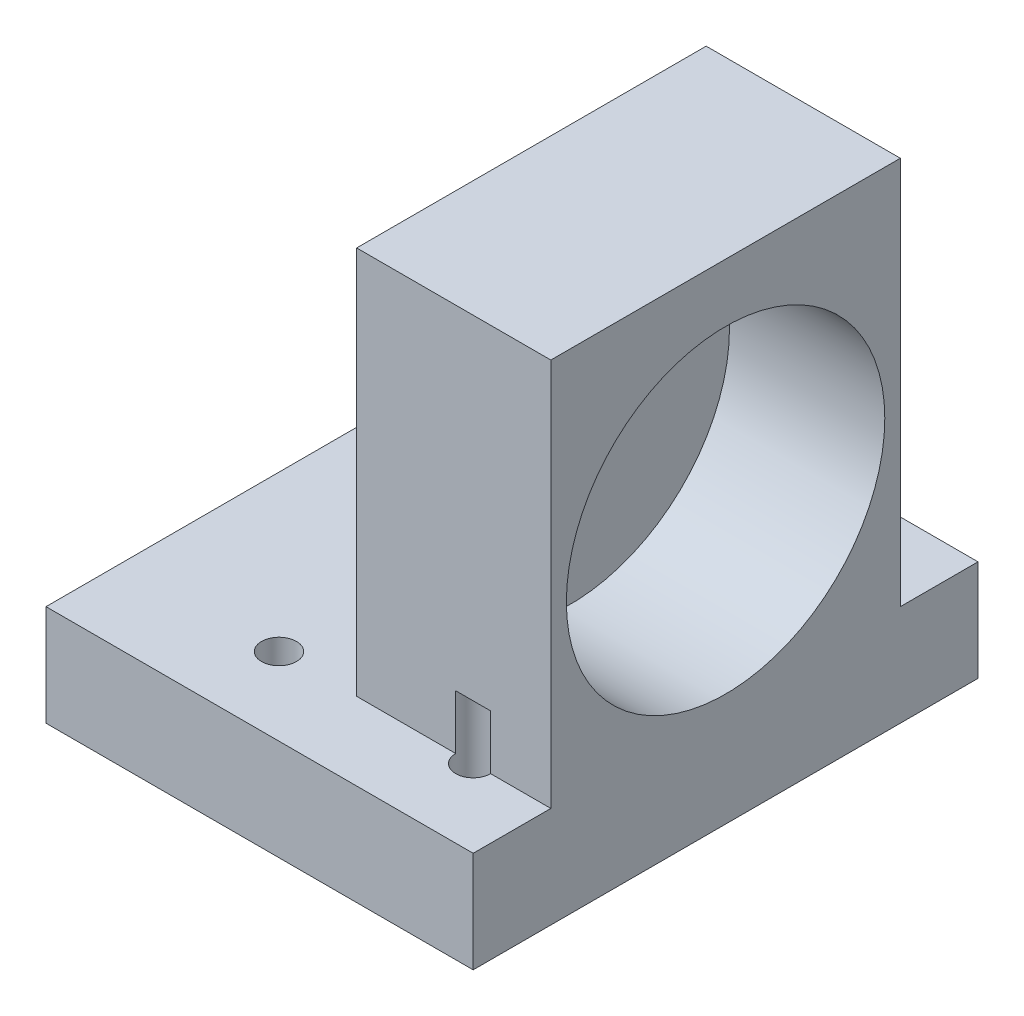
ISO-10303-21;
HEADER;
FILE_DESCRIPTION(('STEP AP214'),'2;1');
FILE_NAME('part.step','',(''),(''),'','','');
FILE_SCHEMA(('AUTOMOTIVE_DESIGN { 1 0 10303 214 1 1 1 1 }'));
ENDSEC;
DATA;
#1=APPLICATION_CONTEXT('core data for automotive mechanical design processes');
#2=APPLICATION_PROTOCOL_DEFINITION('international standard','automotive_design',2000,#1);
#3=PRODUCT_CONTEXT('',#1,'mechanical');
#4=PRODUCT('Part','Part','',(#3));
#5=PRODUCT_RELATED_PRODUCT_CATEGORY('part','',(#4));
#6=PRODUCT_DEFINITION_FORMATION('','',#4);
#7=PRODUCT_DEFINITION_CONTEXT('part definition',#1,'design');
#8=PRODUCT_DEFINITION('design','',#6,#7);
#9=PRODUCT_DEFINITION_SHAPE('','',#8);
#10=(LENGTH_UNIT() NAMED_UNIT(*) SI_UNIT(.MILLI.,.METRE.));
#11=(NAMED_UNIT(*) PLANE_ANGLE_UNIT() SI_UNIT($,.RADIAN.));
#12=(NAMED_UNIT(*) SI_UNIT($,.STERADIAN.) SOLID_ANGLE_UNIT());
#13=UNCERTAINTY_MEASURE_WITH_UNIT(LENGTH_MEASURE(1.E-05),#10,'distance_accuracy_value','');
#14=(GEOMETRIC_REPRESENTATION_CONTEXT(3) GLOBAL_UNCERTAINTY_ASSIGNED_CONTEXT((#13)) GLOBAL_UNIT_ASSIGNED_CONTEXT((#10,
#11,#12)) REPRESENTATION_CONTEXT('',''));
#15=CARTESIAN_POINT('',(0.,0.,0.));
#16=DIRECTION('',(0.,0.,1.));
#17=DIRECTION('',(1.,0.,0.));
#18=AXIS2_PLACEMENT_3D('',#15,#16,#17);
#19=CARTESIAN_POINT('',(-32.5,13.,-32.5));
#20=DIRECTION('',(1.,0.,0.));
#21=DIRECTION('',(0.,0.,-1.));
#22=AXIS2_PLACEMENT_3D('',#19,#20,#21);
#23=PLANE('',#22);
#24=DIRECTION('',(0.,0.,1.));
#25=VECTOR('',#24,1.);
#26=CARTESIAN_POINT('',(-32.5,13.,-32.5));
#27=LINE('',#26,#25);
#28=CARTESIAN_POINT('',(-32.5,13.,-22.5));
#29=VERTEX_POINT('',#28);
#30=CARTESIAN_POINT('',(-32.5,13.,32.5));
#31=VERTEX_POINT('',#30);
#32=EDGE_CURVE('E191',#29,#31,#27,.T.);
#33=ORIENTED_EDGE('',*,*,#32,.F.);
#34=DIRECTION('',(0.,-1.,0.));
#35=VECTOR('',#34,1.);
#36=CARTESIAN_POINT('',(-32.5,13.,-22.5));
#37=LINE('',#36,#35);
#38=CARTESIAN_POINT('',(-32.5,0.,-22.5));
#39=VERTEX_POINT('',#38);
#40=EDGE_CURVE('E179',#29,#39,#37,.T.);
#41=ORIENTED_EDGE('',*,*,#40,.T.);
#42=DIRECTION('',(0.,0.,1.));
#43=VECTOR('',#42,1.);
#44=CARTESIAN_POINT('',(-32.5,0.,-32.5));
#45=LINE('',#44,#43);
#46=CARTESIAN_POINT('',(-32.5,0.,32.5));
#47=VERTEX_POINT('',#46);
#48=EDGE_CURVE('E189',#39,#47,#45,.T.);
#49=ORIENTED_EDGE('',*,*,#48,.T.);
#50=DIRECTION('',(0.,-1.,0.));
#51=VECTOR('',#50,1.);
#52=CARTESIAN_POINT('',(-32.5,13.,32.5));
#53=LINE('',#52,#51);
#54=EDGE_CURVE('E149',#31,#47,#53,.T.);
#55=ORIENTED_EDGE('',*,*,#54,.F.);
#56=EDGE_LOOP('',(#33,#41,#49,#55));
#57=FACE_BOUND('',#56,.T.);
#58=ADVANCED_FACE('F44',(#57),#23,.F.);
#59=CARTESIAN_POINT('',(-32.5,13.,32.5));
#60=DIRECTION('',(0.,0.,-1.));
#61=DIRECTION('',(-1.,0.,0.));
#62=AXIS2_PLACEMENT_3D('',#59,#60,#61);
#63=PLANE('',#62);
#64=DIRECTION('',(1.,0.,0.));
#65=VECTOR('',#64,1.);
#66=CARTESIAN_POINT('',(-32.5,0.,32.5));
#67=LINE('',#66,#65);
#68=CARTESIAN_POINT('',(22.5,0.,32.5));
#69=VERTEX_POINT('',#68);
#70=EDGE_CURVE('E196',#47,#69,#67,.T.);
#71=ORIENTED_EDGE('',*,*,#70,.T.);
#72=DIRECTION('',(0.,-1.,0.));
#73=VECTOR('',#72,1.);
#74=CARTESIAN_POINT('',(22.5,13.,32.5));
#75=LINE('',#74,#73);
#76=CARTESIAN_POINT('',(22.5,13.,32.5));
#77=VERTEX_POINT('',#76);
#78=EDGE_CURVE('E221',#77,#69,#75,.T.);
#79=ORIENTED_EDGE('',*,*,#78,.F.);
#80=DIRECTION('',(1.,0.,0.));
#81=VECTOR('',#80,1.);
#82=CARTESIAN_POINT('',(-32.5,13.,32.5));
#83=LINE('',#82,#81);
#84=EDGE_CURVE('E289',#31,#77,#83,.T.);
#85=ORIENTED_EDGE('',*,*,#84,.F.);
#86=ORIENTED_EDGE('',*,*,#54,.T.);
#87=EDGE_LOOP('',(#71,#79,#85,#86));
#88=FACE_BOUND('',#87,.T.);
#89=ADVANCED_FACE('F317',(#88),#63,.F.);
#90=CARTESIAN_POINT('',(22.5,13.,-32.5));
#91=DIRECTION('',(-1.,0.,0.));
#92=DIRECTION('',(0.,0.,1.));
#93=AXIS2_PLACEMENT_3D('',#90,#91,#92);
#94=PLANE('',#93);
#95=CARTESIAN_POINT('',(22.5,35.,0.));
#96=DIRECTION('',(1.,0.,0.));
#97=DIRECTION('',(0.,0.,-1.));
#98=AXIS2_PLACEMENT_3D('',#95,#96,#97);
#99=CIRCLE('',#98,20.5);
#100=CARTESIAN_POINT('',(22.5,35.,-20.5));
#101=VERTEX_POINT('',#100);
#102=EDGE_CURVE('E229',#101,#101,#99,.T.);
#103=ORIENTED_EDGE('',*,*,#102,.F.);
#104=EDGE_LOOP('',(#103));
#105=FACE_BOUND('',#104,.T.);
#106=DIRECTION('',(0.,0.,-1.));
#107=VECTOR('',#106,1.);
#108=CARTESIAN_POINT('',(22.5,0.,-32.5));
#109=LINE('',#108,#107);
#110=CARTESIAN_POINT('',(22.5,0.,-32.5));
#111=VERTEX_POINT('',#110);
#112=EDGE_CURVE('E203',#69,#111,#109,.T.);
#113=ORIENTED_EDGE('',*,*,#112,.T.);
#114=DIRECTION('',(0.,-1.,0.));
#115=VECTOR('',#114,1.);
#116=CARTESIAN_POINT('',(22.5,13.,-32.5));
#117=LINE('',#116,#115);
#118=CARTESIAN_POINT('',(22.5,13.,-32.5));
#119=VERTEX_POINT('',#118);
#120=EDGE_CURVE('E217',#119,#111,#117,.T.);
#121=ORIENTED_EDGE('',*,*,#120,.F.);
#122=DIRECTION('',(0.,0.,-1.));
#123=VECTOR('',#122,1.);
#124=CARTESIAN_POINT('',(22.5,13.,-32.5));
#125=LINE('',#124,#123);
#126=CARTESIAN_POINT('',(22.5,13.,-22.5));
#127=VERTEX_POINT('',#126);
#128=EDGE_CURVE('E291',#127,#119,#125,.T.);
#129=ORIENTED_EDGE('',*,*,#128,.F.);
#130=DIRECTION('',(0.,-1.,0.));
#131=VECTOR('',#130,1.);
#132=CARTESIAN_POINT('',(22.5,63.,-22.5));
#133=LINE('',#132,#131);
#134=CARTESIAN_POINT('',(22.5,63.,-22.5));
#135=VERTEX_POINT('',#134);
#136=EDGE_CURVE('E199',#135,#127,#133,.T.);
#137=ORIENTED_EDGE('',*,*,#136,.F.);
#138=DIRECTION('',(0.,0.,-1.));
#139=VECTOR('',#138,1.);
#140=CARTESIAN_POINT('',(22.5,63.,-22.5));
#141=LINE('',#140,#139);
#142=CARTESIAN_POINT('',(22.5,63.,22.5));
#143=VERTEX_POINT('',#142);
#144=EDGE_CURVE('E253',#143,#135,#141,.T.);
#145=ORIENTED_EDGE('',*,*,#144,.F.);
#146=DIRECTION('',(0.,-1.,0.));
#147=VECTOR('',#146,1.);
#148=CARTESIAN_POINT('',(22.5,63.,22.5));
#149=LINE('',#148,#147);
#150=CARTESIAN_POINT('',(22.5,13.,22.5));
#151=VERTEX_POINT('',#150);
#152=EDGE_CURVE('E266',#143,#151,#149,.T.);
#153=ORIENTED_EDGE('',*,*,#152,.T.);
#154=EDGE_CURVE('E292',#77,#151,#125,.T.);
#155=ORIENTED_EDGE('',*,*,#154,.F.);
#156=ORIENTED_EDGE('',*,*,#78,.T.);
#157=EDGE_LOOP('',(#113,#121,#129,#137,#145,#153,#155,#156));
#158=FACE_BOUND('',#157,.T.);
#159=ADVANCED_FACE('F307',(#105,#158),#94,.F.);
#160=CARTESIAN_POINT('',(-32.5,13.,-32.5));
#161=DIRECTION('',(0.,0.,1.));
#162=DIRECTION('',(1.,0.,0.));
#163=AXIS2_PLACEMENT_3D('',#160,#161,#162);
#164=PLANE('',#163);
#165=DIRECTION('',(-1.,0.,0.));
#166=VECTOR('',#165,1.);
#167=CARTESIAN_POINT('',(-32.5,0.,-32.5));
#168=LINE('',#167,#166);
#169=CARTESIAN_POINT('',(-22.5,0.,-32.5));
#170=VERTEX_POINT('',#169);
#171=EDGE_CURVE('E214',#111,#170,#168,.T.);
#172=ORIENTED_EDGE('',*,*,#171,.T.);
#173=DIRECTION('',(0.,-1.,0.));
#174=VECTOR('',#173,1.);
#175=CARTESIAN_POINT('',(-22.5,13.,-32.5));
#176=LINE('',#175,#174);
#177=CARTESIAN_POINT('',(-22.5,13.,-32.5));
#178=VERTEX_POINT('',#177);
#179=EDGE_CURVE('E53',#170,#178,#176,.F.);
#180=ORIENTED_EDGE('',*,*,#179,.T.);
#181=DIRECTION('',(-1.,0.,0.));
#182=VECTOR('',#181,1.);
#183=CARTESIAN_POINT('',(-32.5,13.,-32.5));
#184=LINE('',#183,#182);
#185=EDGE_CURVE('E209',#119,#178,#184,.T.);
#186=ORIENTED_EDGE('',*,*,#185,.F.);
#187=ORIENTED_EDGE('',*,*,#120,.T.);
#188=EDGE_LOOP('',(#172,#180,#186,#187));
#189=FACE_BOUND('',#188,.T.);
#190=ADVANCED_FACE('F308',(#189),#164,.F.);
#191=CARTESIAN_POINT('',(0.,13.,0.));
#192=DIRECTION('',(0.,1.,0.));
#193=DIRECTION('',(0.,0.,1.));
#194=AXIS2_PLACEMENT_3D('',#191,#192,#193);
#195=PLANE('',#194);
#196=ORIENTED_EDGE('',*,*,#185,.T.);
#197=CARTESIAN_POINT('',(-22.5,13.,-22.5));
#198=DIRECTION('',(0.,1.,0.));
#199=DIRECTION('',(0.,0.,1.));
#200=AXIS2_PLACEMENT_3D('',#197,#198,#199);
#201=CIRCLE('',#200,10.);
#202=EDGE_CURVE('E11',#178,#29,#201,.T.);
#203=ORIENTED_EDGE('',*,*,#202,.T.);
#204=ORIENTED_EDGE('',*,*,#32,.T.);
#205=ORIENTED_EDGE('',*,*,#84,.T.);
#206=ORIENTED_EDGE('',*,*,#154,.T.);
#207=DIRECTION('',(1.,0.,0.));
#208=VECTOR('',#207,1.);
#209=CARTESIAN_POINT('',(22.5,13.,22.5));
#210=LINE('',#209,#208);
#211=CARTESIAN_POINT('',(14.75,13.,22.5));
#212=VERTEX_POINT('',#211);
#213=EDGE_CURVE('E275',#212,#151,#210,.T.);
#214=ORIENTED_EDGE('',*,*,#213,.F.);
#215=CARTESIAN_POINT('',(12.5,13.,22.5));
#216=DIRECTION('',(0.,1.,0.));
#217=DIRECTION('',(0.,0.,1.));
#218=AXIS2_PLACEMENT_3D('',#215,#216,#217);
#219=CIRCLE('',#218,2.25);
#220=CARTESIAN_POINT('',(10.25,13.,22.5));
#221=VERTEX_POINT('',#220);
#222=EDGE_CURVE('E356',#221,#212,#219,.T.);
#223=ORIENTED_EDGE('',*,*,#222,.F.);
#224=CARTESIAN_POINT('',(-2.49999999999999,13.,22.5));
#225=VERTEX_POINT('',#224);
#226=EDGE_CURVE('E161',#225,#221,#210,.T.);
#227=ORIENTED_EDGE('',*,*,#226,.F.);
#228=DIRECTION('',(0.,0.,1.));
#229=VECTOR('',#228,1.);
#230=CARTESIAN_POINT('',(-2.5,13.,-22.5));
#231=LINE('',#230,#229);
#232=CARTESIAN_POINT('',(-2.5,13.,-22.5));
#233=VERTEX_POINT('',#232);
#234=EDGE_CURVE('E271',#233,#225,#231,.T.);
#235=ORIENTED_EDGE('',*,*,#234,.F.);
#236=DIRECTION('',(-1.,0.,0.));
#237=VECTOR('',#236,1.);
#238=CARTESIAN_POINT('',(22.5,13.,-22.5));
#239=LINE('',#238,#237);
#240=CARTESIAN_POINT('',(10.25,13.,-22.5));
#241=VERTEX_POINT('',#240);
#242=EDGE_CURVE('E251',#241,#233,#239,.T.);
#243=ORIENTED_EDGE('',*,*,#242,.F.);
#244=CARTESIAN_POINT('',(12.5,13.,-22.5));
#245=DIRECTION('',(0.,1.,0.));
#246=DIRECTION('',(0.,0.,1.));
#247=AXIS2_PLACEMENT_3D('',#244,#245,#246);
#248=CIRCLE('',#247,2.25);
#249=CARTESIAN_POINT('',(14.75,13.,-22.5));
#250=VERTEX_POINT('',#249);
#251=EDGE_CURVE('E353',#250,#241,#248,.T.);
#252=ORIENTED_EDGE('',*,*,#251,.F.);
#253=EDGE_CURVE('E267',#127,#250,#239,.T.);
#254=ORIENTED_EDGE('',*,*,#253,.F.);
#255=ORIENTED_EDGE('',*,*,#128,.T.);
#256=EDGE_LOOP('',(#196,#203,#204,#205,#206,#214,#223,#227,#235,#243,#252,#254,#255));
#257=FACE_BOUND('',#256,.T.);
#258=CARTESIAN_POINT('',(-12.5,13.,-22.5));
#259=DIRECTION('',(0.,1.,0.));
#260=DIRECTION('',(0.,0.,1.));
#261=AXIS2_PLACEMENT_3D('',#258,#259,#260);
#262=CIRCLE('',#261,2.25);
#263=CARTESIAN_POINT('',(-12.5,13.,-20.25));
#264=VERTEX_POINT('',#263);
#265=EDGE_CURVE('E239',#264,#264,#262,.T.);
#266=ORIENTED_EDGE('',*,*,#265,.F.);
#267=EDGE_LOOP('',(#266));
#268=FACE_BOUND('',#267,.T.);
#269=CARTESIAN_POINT('',(-12.5,13.,22.5));
#270=DIRECTION('',(0.,1.,0.));
#271=DIRECTION('',(0.,0.,1.));
#272=AXIS2_PLACEMENT_3D('',#269,#270,#271);
#273=CIRCLE('',#272,2.25);
#274=CARTESIAN_POINT('',(-12.5,13.,24.75));
#275=VERTEX_POINT('',#274);
#276=EDGE_CURVE('E245',#275,#275,#273,.T.);
#277=ORIENTED_EDGE('',*,*,#276,.F.);
#278=EDGE_LOOP('',(#277));
#279=FACE_BOUND('',#278,.T.);
#280=ADVANCED_FACE('F302',(#257,#268,#279),#195,.T.);
#281=CARTESIAN_POINT('',(0.,0.,0.));
#282=DIRECTION('',(0.,1.,0.));
#283=DIRECTION('',(0.,0.,1.));
#284=AXIS2_PLACEMENT_3D('',#281,#282,#283);
#285=PLANE('',#284);
#286=CARTESIAN_POINT('',(12.5,0.,22.5));
#287=DIRECTION('',(0.,-1.,0.));
#288=DIRECTION('',(0.,0.,-1.));
#289=AXIS2_PLACEMENT_3D('',#286,#287,#288);
#290=CIRCLE('',#289,2.25);
#291=CARTESIAN_POINT('',(12.5,0.,20.25));
#292=VERTEX_POINT('',#291);
#293=EDGE_CURVE('E156',#292,#292,#290,.T.);
#294=ORIENTED_EDGE('',*,*,#293,.F.);
#295=EDGE_LOOP('',(#294));
#296=FACE_BOUND('',#295,.T.);
#297=CARTESIAN_POINT('',(12.5,0.,-22.5));
#298=DIRECTION('',(0.,-1.,0.));
#299=DIRECTION('',(0.,0.,-1.));
#300=AXIS2_PLACEMENT_3D('',#297,#298,#299);
#301=CIRCLE('',#300,2.25);
#302=CARTESIAN_POINT('',(12.5,0.,-24.75));
#303=VERTEX_POINT('',#302);
#304=EDGE_CURVE('E373',#303,#303,#301,.T.);
#305=ORIENTED_EDGE('',*,*,#304,.F.);
#306=EDGE_LOOP('',(#305));
#307=FACE_BOUND('',#306,.T.);
#308=CARTESIAN_POINT('',(-12.5,0.,-22.5));
#309=DIRECTION('',(0.,-1.,0.));
#310=DIRECTION('',(0.,0.,-1.));
#311=AXIS2_PLACEMENT_3D('',#308,#309,#310);
#312=CIRCLE('',#311,2.25);
#313=CARTESIAN_POINT('',(-12.5,0.,-24.75));
#314=VERTEX_POINT('',#313);
#315=EDGE_CURVE('E366',#314,#314,#312,.T.);
#316=ORIENTED_EDGE('',*,*,#315,.F.);
#317=EDGE_LOOP('',(#316));
#318=FACE_BOUND('',#317,.T.);
#319=CARTESIAN_POINT('',(-12.5,0.,22.5));
#320=DIRECTION('',(0.,-1.,0.));
#321=DIRECTION('',(0.,0.,-1.));
#322=AXIS2_PLACEMENT_3D('',#319,#320,#321);
#323=CIRCLE('',#322,2.25);
#324=CARTESIAN_POINT('',(-12.5,0.,20.25));
#325=VERTEX_POINT('',#324);
#326=EDGE_CURVE('E361',#325,#325,#323,.T.);
#327=ORIENTED_EDGE('',*,*,#326,.F.);
#328=EDGE_LOOP('',(#327));
#329=FACE_BOUND('',#328,.T.);
#330=ORIENTED_EDGE('',*,*,#48,.F.);
#331=CARTESIAN_POINT('',(-22.5,0.,-22.5));
#332=DIRECTION('',(0.,1.,0.));
#333=DIRECTION('',(0.,0.,1.));
#334=AXIS2_PLACEMENT_3D('',#331,#332,#333);
#335=CIRCLE('',#334,10.);
#336=EDGE_CURVE('E67',#39,#170,#335,.F.);
#337=ORIENTED_EDGE('',*,*,#336,.T.);
#338=ORIENTED_EDGE('',*,*,#171,.F.);
#339=ORIENTED_EDGE('',*,*,#112,.F.);
#340=ORIENTED_EDGE('',*,*,#70,.F.);
#341=EDGE_LOOP('',(#330,#337,#338,#339,#340));
#342=FACE_BOUND('',#341,.T.);
#343=ADVANCED_FACE('F194',(#296,#307,#318,#329,#342),#285,.F.);
#344=CARTESIAN_POINT('',(22.5,63.,-22.5));
#345=DIRECTION('',(0.,0.,1.));
#346=DIRECTION('',(1.,0.,0.));
#347=AXIS2_PLACEMENT_3D('',#344,#345,#346);
#348=PLANE('',#347);
#349=DIRECTION('',(1.,0.,0.));
#350=VECTOR('',#349,1.);
#351=CARTESIAN_POINT('',(22.5,20.,-22.5));
#352=LINE('',#351,#350);
#353=CARTESIAN_POINT('',(10.25,20.,-22.5));
#354=VERTEX_POINT('',#353);
#355=CARTESIAN_POINT('',(14.75,20.,-22.5));
#356=VERTEX_POINT('',#355);
#357=EDGE_CURVE('E165',#354,#356,#352,.T.);
#358=ORIENTED_EDGE('',*,*,#357,.F.);
#359=DIRECTION('',(0.,-1.,0.));
#360=VECTOR('',#359,1.);
#361=CARTESIAN_POINT('',(10.25,20.,-22.5));
#362=LINE('',#361,#360);
#363=EDGE_CURVE('E175',#354,#241,#362,.T.);
#364=ORIENTED_EDGE('',*,*,#363,.T.);
#365=ORIENTED_EDGE('',*,*,#242,.T.);
#366=DIRECTION('',(0.,-1.,0.));
#367=VECTOR('',#366,1.);
#368=CARTESIAN_POINT('',(-2.5,63.,-22.5));
#369=LINE('',#368,#367);
#370=CARTESIAN_POINT('',(-2.5,63.,-22.5));
#371=VERTEX_POINT('',#370);
#372=EDGE_CURVE('E206',#371,#233,#369,.T.);
#373=ORIENTED_EDGE('',*,*,#372,.F.);
#374=DIRECTION('',(-1.,0.,0.));
#375=VECTOR('',#374,1.);
#376=CARTESIAN_POINT('',(22.5,63.,-22.5));
#377=LINE('',#376,#375);
#378=EDGE_CURVE('E257',#135,#371,#377,.T.);
#379=ORIENTED_EDGE('',*,*,#378,.F.);
#380=ORIENTED_EDGE('',*,*,#136,.T.);
#381=ORIENTED_EDGE('',*,*,#253,.T.);
#382=DIRECTION('',(0.,-1.,0.));
#383=VECTOR('',#382,1.);
#384=CARTESIAN_POINT('',(14.75,20.,-22.5));
#385=LINE('',#384,#383);
#386=EDGE_CURVE('E171',#250,#356,#385,.F.);
#387=ORIENTED_EDGE('',*,*,#386,.T.);
#388=EDGE_LOOP('',(#358,#364,#365,#373,#379,#380,#381,#387));
#389=FACE_BOUND('',#388,.T.);
#390=ADVANCED_FACE('F342',(#389),#348,.F.);
#391=CARTESIAN_POINT('',(-2.5,63.,-22.5));
#392=DIRECTION('',(1.,0.,0.));
#393=DIRECTION('',(0.,0.,-1.));
#394=AXIS2_PLACEMENT_3D('',#391,#392,#393);
#395=PLANE('',#394);
#396=CARTESIAN_POINT('',(-2.5,35.,0.));
#397=DIRECTION('',(1.,0.,0.));
#398=DIRECTION('',(0.,0.,-1.));
#399=AXIS2_PLACEMENT_3D('',#396,#397,#398);
#400=CIRCLE('',#399,7.);
#401=CARTESIAN_POINT('',(-2.5,35.,-7.));
#402=VERTEX_POINT('',#401);
#403=EDGE_CURVE('E226',#402,#402,#400,.T.);
#404=ORIENTED_EDGE('',*,*,#403,.T.);
#405=EDGE_LOOP('',(#404));
#406=FACE_BOUND('',#405,.T.);
#407=ORIENTED_EDGE('',*,*,#234,.T.);
#408=DIRECTION('',(0.,-1.,0.));
#409=VECTOR('',#408,1.);
#410=CARTESIAN_POINT('',(-2.49999999999999,63.,22.5));
#411=LINE('',#410,#409);
#412=CARTESIAN_POINT('',(-2.49999999999999,63.,22.5));
#413=VERTEX_POINT('',#412);
#414=EDGE_CURVE('E281',#413,#225,#411,.T.);
#415=ORIENTED_EDGE('',*,*,#414,.F.);
#416=DIRECTION('',(0.,0.,1.));
#417=VECTOR('',#416,1.);
#418=CARTESIAN_POINT('',(-2.5,63.,-22.5));
#419=LINE('',#418,#417);
#420=EDGE_CURVE('E260',#371,#413,#419,.T.);
#421=ORIENTED_EDGE('',*,*,#420,.F.);
#422=ORIENTED_EDGE('',*,*,#372,.T.);
#423=EDGE_LOOP('',(#407,#415,#421,#422));
#424=FACE_BOUND('',#423,.T.);
#425=ADVANCED_FACE('F347',(#406,#424),#395,.F.);
#426=CARTESIAN_POINT('',(22.5,63.,22.5));
#427=DIRECTION('',(0.,0.,-1.));
#428=DIRECTION('',(-1.,0.,0.));
#429=AXIS2_PLACEMENT_3D('',#426,#427,#428);
#430=PLANE('',#429);
#431=DIRECTION('',(-1.,0.,0.));
#432=VECTOR('',#431,1.);
#433=CARTESIAN_POINT('',(22.5,20.,22.5));
#434=LINE('',#433,#432);
#435=CARTESIAN_POINT('',(14.75,20.,22.5));
#436=VERTEX_POINT('',#435);
#437=CARTESIAN_POINT('',(10.25,20.,22.5));
#438=VERTEX_POINT('',#437);
#439=EDGE_CURVE('E139',#436,#438,#434,.T.);
#440=ORIENTED_EDGE('',*,*,#439,.F.);
#441=DIRECTION('',(0.,-1.,0.));
#442=VECTOR('',#441,1.);
#443=CARTESIAN_POINT('',(14.75,20.,22.5));
#444=LINE('',#443,#442);
#445=EDGE_CURVE('E154',#436,#212,#444,.T.);
#446=ORIENTED_EDGE('',*,*,#445,.T.);
#447=ORIENTED_EDGE('',*,*,#213,.T.);
#448=ORIENTED_EDGE('',*,*,#152,.F.);
#449=DIRECTION('',(1.,0.,0.));
#450=VECTOR('',#449,1.);
#451=CARTESIAN_POINT('',(22.5,63.,22.5));
#452=LINE('',#451,#450);
#453=EDGE_CURVE('E263',#413,#143,#452,.T.);
#454=ORIENTED_EDGE('',*,*,#453,.F.);
#455=ORIENTED_EDGE('',*,*,#414,.T.);
#456=ORIENTED_EDGE('',*,*,#226,.T.);
#457=DIRECTION('',(0.,-1.,0.));
#458=VECTOR('',#457,1.);
#459=CARTESIAN_POINT('',(10.25,20.,22.5));
#460=LINE('',#459,#458);
#461=EDGE_CURVE('E148',#221,#438,#460,.F.);
#462=ORIENTED_EDGE('',*,*,#461,.T.);
#463=EDGE_LOOP('',(#440,#446,#447,#448,#454,#455,#456,#462));
#464=FACE_BOUND('',#463,.T.);
#465=ADVANCED_FACE('F159',(#464),#430,.F.);
#466=CARTESIAN_POINT('',(0.,63.,0.));
#467=DIRECTION('',(0.,-1.,0.));
#468=DIRECTION('',(0.,0.,-1.));
#469=AXIS2_PLACEMENT_3D('',#466,#467,#468);
#470=PLANE('',#469);
#471=ORIENTED_EDGE('',*,*,#144,.T.);
#472=ORIENTED_EDGE('',*,*,#378,.T.);
#473=ORIENTED_EDGE('',*,*,#420,.T.);
#474=ORIENTED_EDGE('',*,*,#453,.T.);
#475=EDGE_LOOP('',(#471,#472,#473,#474));
#476=FACE_BOUND('',#475,.T.);
#477=ADVANCED_FACE('F349',(#476),#470,.F.);
#478=CARTESIAN_POINT('',(2.5,35.,0.));
#479=DIRECTION('',(1.,0.,0.));
#480=DIRECTION('',(0.,0.,-1.));
#481=AXIS2_PLACEMENT_3D('',#478,#479,#480);
#482=CYLINDRICAL_SURFACE('',#481,20.5);
#483=CARTESIAN_POINT('',(2.5,35.,0.));
#484=DIRECTION('',(1.,0.,0.));
#485=DIRECTION('',(0.,0.,-1.));
#486=AXIS2_PLACEMENT_3D('',#483,#484,#485);
#487=CIRCLE('',#486,20.5);
#488=CARTESIAN_POINT('',(2.5,35.,-20.5));
#489=VERTEX_POINT('',#488);
#490=EDGE_CURVE('E236',#489,#489,#487,.T.);
#491=ORIENTED_EDGE('',*,*,#490,.F.);
#492=EDGE_LOOP('',(#491));
#493=FACE_BOUND('',#492,.T.);
#494=ORIENTED_EDGE('',*,*,#102,.T.);
#495=EDGE_LOOP('',(#494));
#496=FACE_BOUND('',#495,.T.);
#497=ADVANCED_FACE('F409',(#493,#496),#482,.F.);
#498=CARTESIAN_POINT('',(2.5,35.,0.));
#499=DIRECTION('',(1.,0.,0.));
#500=DIRECTION('',(0.,0.,-1.));
#501=AXIS2_PLACEMENT_3D('',#498,#499,#500);
#502=PLANE('',#501);
#503=CARTESIAN_POINT('',(2.5,35.,0.));
#504=DIRECTION('',(1.,0.,0.));
#505=DIRECTION('',(0.,0.,-1.));
#506=AXIS2_PLACEMENT_3D('',#503,#504,#505);
#507=CIRCLE('',#506,7.);
#508=CARTESIAN_POINT('',(2.5,35.,-7.));
#509=VERTEX_POINT('',#508);
#510=EDGE_CURVE('E230',#509,#509,#507,.T.);
#511=ORIENTED_EDGE('',*,*,#510,.F.);
#512=EDGE_LOOP('',(#511));
#513=FACE_BOUND('',#512,.T.);
#514=ORIENTED_EDGE('',*,*,#490,.T.);
#515=EDGE_LOOP('',(#514));
#516=FACE_BOUND('',#515,.T.);
#517=ADVANCED_FACE('F406',(#513,#516),#502,.T.);
#518=CARTESIAN_POINT('',(-17.5,35.,0.));
#519=DIRECTION('',(1.,0.,0.));
#520=DIRECTION('',(0.,0.,-1.));
#521=AXIS2_PLACEMENT_3D('',#518,#519,#520);
#522=CYLINDRICAL_SURFACE('',#521,7.);
#523=ORIENTED_EDGE('',*,*,#510,.T.);
#524=EDGE_LOOP('',(#523));
#525=FACE_BOUND('',#524,.T.);
#526=ORIENTED_EDGE('',*,*,#403,.F.);
#527=EDGE_LOOP('',(#526));
#528=FACE_BOUND('',#527,.T.);
#529=ADVANCED_FACE('F403',(#525,#528),#522,.F.);
#530=CARTESIAN_POINT('',(12.5,20.,22.5));
#531=DIRECTION('',(0.,-1.,0.));
#532=DIRECTION('',(0.,0.,-1.));
#533=AXIS2_PLACEMENT_3D('',#530,#531,#532);
#534=CYLINDRICAL_SURFACE('',#533,2.25);
#535=ORIENTED_EDGE('',*,*,#293,.T.);
#536=EDGE_LOOP('',(#535));
#537=FACE_BOUND('',#536,.T.);
#538=CARTESIAN_POINT('',(12.5,20.,22.5));
#539=DIRECTION('',(0.,-1.,0.));
#540=DIRECTION('',(0.,0.,-1.));
#541=AXIS2_PLACEMENT_3D('',#538,#539,#540);
#542=CIRCLE('',#541,2.25);
#543=EDGE_CURVE('E142',#438,#436,#542,.T.);
#544=ORIENTED_EDGE('',*,*,#543,.F.);
#545=ORIENTED_EDGE('',*,*,#461,.F.);
#546=ORIENTED_EDGE('',*,*,#222,.T.);
#547=ORIENTED_EDGE('',*,*,#445,.F.);
#548=EDGE_LOOP('',(#544,#545,#546,#547));
#549=FACE_BOUND('',#548,.T.);
#550=ADVANCED_FACE('F152',(#537,#549),#534,.F.);
#551=CARTESIAN_POINT('',(12.5,20.,22.5));
#552=DIRECTION('',(0.,-1.,0.));
#553=DIRECTION('',(0.,0.,-1.));
#554=AXIS2_PLACEMENT_3D('',#551,#552,#553);
#555=PLANE('',#554);
#556=ORIENTED_EDGE('',*,*,#439,.T.);
#557=ORIENTED_EDGE('',*,*,#543,.T.);
#558=EDGE_LOOP('',(#556,#557));
#559=FACE_BOUND('',#558,.T.);
#560=ADVANCED_FACE('F141',(#559),#555,.T.);
#561=CARTESIAN_POINT('',(12.5,20.,-22.5));
#562=DIRECTION('',(0.,-1.,0.));
#563=DIRECTION('',(0.,0.,-1.));
#564=AXIS2_PLACEMENT_3D('',#561,#562,#563);
#565=CYLINDRICAL_SURFACE('',#564,2.25);
#566=ORIENTED_EDGE('',*,*,#304,.T.);
#567=EDGE_LOOP('',(#566));
#568=FACE_BOUND('',#567,.T.);
#569=CARTESIAN_POINT('',(12.5,20.,-22.5));
#570=DIRECTION('',(0.,-1.,0.));
#571=DIRECTION('',(0.,0.,-1.));
#572=AXIS2_PLACEMENT_3D('',#569,#570,#571);
#573=CIRCLE('',#572,2.25);
#574=EDGE_CURVE('E354',#356,#354,#573,.T.);
#575=ORIENTED_EDGE('',*,*,#574,.F.);
#576=ORIENTED_EDGE('',*,*,#386,.F.);
#577=ORIENTED_EDGE('',*,*,#251,.T.);
#578=ORIENTED_EDGE('',*,*,#363,.F.);
#579=EDGE_LOOP('',(#575,#576,#577,#578));
#580=FACE_BOUND('',#579,.T.);
#581=ADVANCED_FACE('F352',(#568,#580),#565,.F.);
#582=CARTESIAN_POINT('',(12.5,20.,-22.5));
#583=DIRECTION('',(0.,-1.,0.));
#584=DIRECTION('',(0.,0.,-1.));
#585=AXIS2_PLACEMENT_3D('',#582,#583,#584);
#586=PLANE('',#585);
#587=ORIENTED_EDGE('',*,*,#357,.T.);
#588=ORIENTED_EDGE('',*,*,#574,.T.);
#589=EDGE_LOOP('',(#587,#588));
#590=FACE_BOUND('',#589,.T.);
#591=ADVANCED_FACE('F390',(#590),#586,.T.);
#592=CARTESIAN_POINT('',(-12.5,20.,22.5));
#593=DIRECTION('',(0.,-1.,0.));
#594=DIRECTION('',(0.,0.,-1.));
#595=AXIS2_PLACEMENT_3D('',#592,#593,#594);
#596=CYLINDRICAL_SURFACE('',#595,2.25);
#597=ORIENTED_EDGE('',*,*,#276,.T.);
#598=EDGE_LOOP('',(#597));
#599=FACE_BOUND('',#598,.T.);
#600=ORIENTED_EDGE('',*,*,#326,.T.);
#601=EDGE_LOOP('',(#600));
#602=FACE_BOUND('',#601,.T.);
#603=ADVANCED_FACE('F388',(#599,#602),#596,.F.);
#604=CARTESIAN_POINT('',(-12.5,20.,-22.5));
#605=DIRECTION('',(0.,-1.,0.));
#606=DIRECTION('',(0.,0.,-1.));
#607=AXIS2_PLACEMENT_3D('',#604,#605,#606);
#608=CYLINDRICAL_SURFACE('',#607,2.25);
#609=ORIENTED_EDGE('',*,*,#265,.T.);
#610=EDGE_LOOP('',(#609));
#611=FACE_BOUND('',#610,.T.);
#612=ORIENTED_EDGE('',*,*,#315,.T.);
#613=EDGE_LOOP('',(#612));
#614=FACE_BOUND('',#613,.T.);
#615=ADVANCED_FACE('F381',(#611,#614),#608,.F.);
#616=CARTESIAN_POINT('',(-22.5,13.,-22.5));
#617=DIRECTION('',(0.,-1.,0.));
#618=DIRECTION('',(0.,0.,-1.));
#619=AXIS2_PLACEMENT_3D('',#616,#617,#618);
#620=CYLINDRICAL_SURFACE('',#619,10.);
#621=ORIENTED_EDGE('',*,*,#202,.F.);
#622=ORIENTED_EDGE('',*,*,#179,.F.);
#623=ORIENTED_EDGE('',*,*,#336,.F.);
#624=ORIENTED_EDGE('',*,*,#40,.F.);
#625=EDGE_LOOP('',(#621,#622,#623,#624));
#626=FACE_BOUND('',#625,.T.);
#627=ADVANCED_FACE('F46',(#626),#620,.T.);
#628=CLOSED_SHELL('',(#58,#89,#159,#190,#280,#343,#390,#425,#465,#477,#497,#517,#529,#550,#560,
#581,#591,#603,#615,#627));
#629=MANIFOLD_SOLID_BREP('B2',#628);
#630=ADVANCED_BREP_SHAPE_REPRESENTATION('',(#18,#629),#14);
#631=SHAPE_DEFINITION_REPRESENTATION(#9,#630);
ENDSEC;
END-ISO-10303-21;
